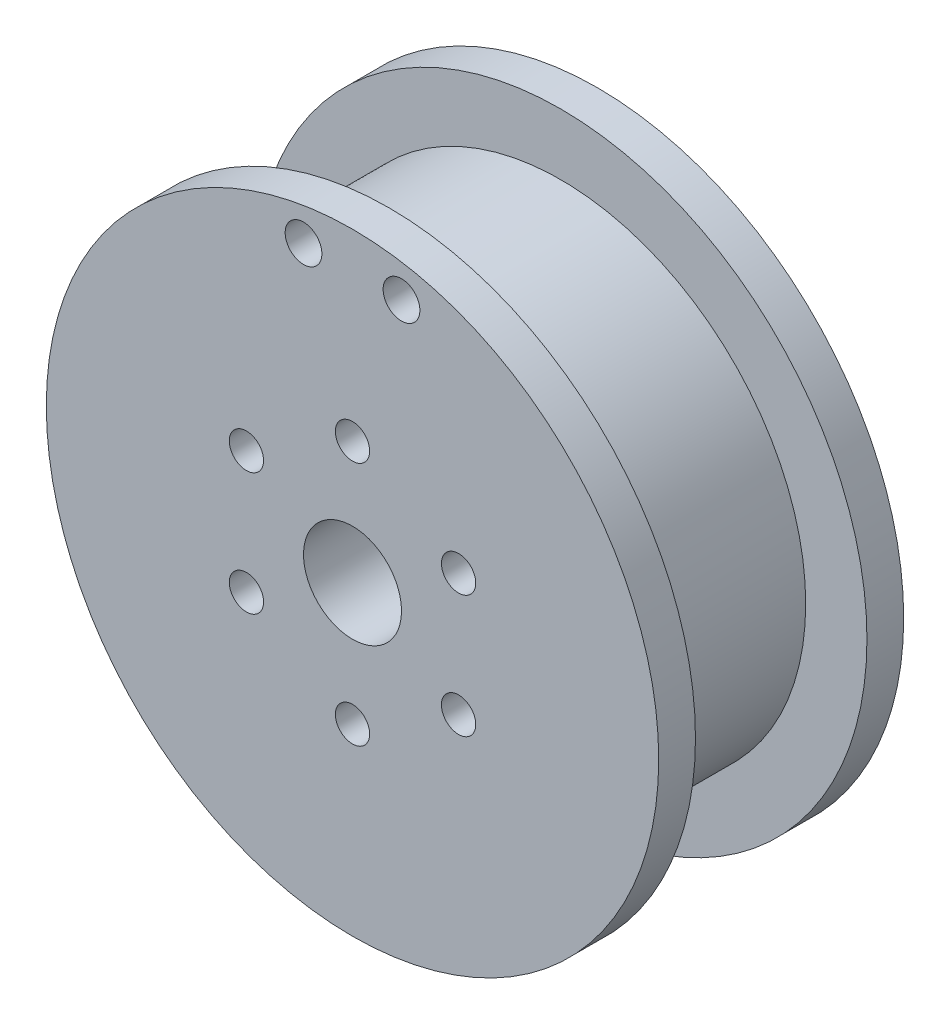
ISO-10303-21;
HEADER;
FILE_DESCRIPTION(('STEP AP214'),'2;1');
FILE_NAME('part.step','',(''),(''),'','','');
FILE_SCHEMA(('AUTOMOTIVE_DESIGN { 1 0 10303 214 1 1 1 1 }'));
ENDSEC;
DATA;
#1=APPLICATION_CONTEXT('core data for automotive mechanical design processes');
#2=APPLICATION_PROTOCOL_DEFINITION('international standard','automotive_design',2000,#1);
#3=PRODUCT_CONTEXT('',#1,'mechanical');
#4=PRODUCT('Part','Part','',(#3));
#5=PRODUCT_RELATED_PRODUCT_CATEGORY('part','',(#4));
#6=PRODUCT_DEFINITION_FORMATION('','',#4);
#7=PRODUCT_DEFINITION_CONTEXT('part definition',#1,'design');
#8=PRODUCT_DEFINITION('design','',#6,#7);
#9=PRODUCT_DEFINITION_SHAPE('','',#8);
#10=(LENGTH_UNIT() NAMED_UNIT(*) SI_UNIT(.MILLI.,.METRE.));
#11=(NAMED_UNIT(*) PLANE_ANGLE_UNIT() SI_UNIT($,.RADIAN.));
#12=(NAMED_UNIT(*) SI_UNIT($,.STERADIAN.) SOLID_ANGLE_UNIT());
#13=UNCERTAINTY_MEASURE_WITH_UNIT(LENGTH_MEASURE(1.E-05),#10,'distance_accuracy_value','');
#14=(GEOMETRIC_REPRESENTATION_CONTEXT(3) GLOBAL_UNCERTAINTY_ASSIGNED_CONTEXT((#13)) GLOBAL_UNIT_ASSIGNED_CONTEXT((#10,
#11,#12)) REPRESENTATION_CONTEXT('',''));
#15=CARTESIAN_POINT('',(0.,0.,0.));
#16=DIRECTION('',(0.,0.,1.));
#17=DIRECTION('',(1.,0.,0.));
#18=AXIS2_PLACEMENT_3D('',#15,#16,#17);
#19=CARTESIAN_POINT('',(0.,0.,10.));
#20=DIRECTION('',(0.,0.,1.));
#21=DIRECTION('',(1.,0.,0.));
#22=AXIS2_PLACEMENT_3D('',#19,#20,#21);
#23=CYLINDRICAL_SURFACE('',#22,20.);
#24=CARTESIAN_POINT('',(0.,0.,7.));
#25=DIRECTION('',(0.,0.,1.));
#26=DIRECTION('',(1.,0.,0.));
#27=AXIS2_PLACEMENT_3D('',#24,#25,#26);
#28=CIRCLE('',#27,20.);
#29=CARTESIAN_POINT('',(20.,0.,7.));
#30=VERTEX_POINT('',#29);
#31=EDGE_CURVE('E65',#30,#30,#28,.T.);
#32=ORIENTED_EDGE('',*,*,#31,.F.);
#33=EDGE_LOOP('',(#32));
#34=FACE_BOUND('',#33,.T.);
#35=CARTESIAN_POINT('',(0.,0.,-7.));
#36=DIRECTION('',(0.,0.,1.));
#37=DIRECTION('',(1.,0.,0.));
#38=AXIS2_PLACEMENT_3D('',#35,#36,#37);
#39=CIRCLE('',#38,20.);
#40=CARTESIAN_POINT('',(20.,0.,-7.));
#41=VERTEX_POINT('',#40);
#42=EDGE_CURVE('E10',#41,#41,#39,.T.);
#43=ORIENTED_EDGE('',*,*,#42,.T.);
#44=EDGE_LOOP('',(#43));
#45=FACE_BOUND('',#44,.T.);
#46=ADVANCED_FACE('F37',(#34,#45),#23,.T.);
#47=CARTESIAN_POINT('',(0.,25.,-7.));
#48=DIRECTION('',(0.,0.,-1.));
#49=DIRECTION('',(-1.,0.,0.));
#50=AXIS2_PLACEMENT_3D('',#47,#48,#49);
#51=PLANE('',#50);
#52=ORIENTED_EDGE('',*,*,#42,.F.);
#53=EDGE_LOOP('',(#52));
#54=FACE_BOUND('',#53,.T.);
#55=CARTESIAN_POINT('',(0.,0.,-7.));
#56=DIRECTION('',(0.,0.,1.));
#57=DIRECTION('',(1.,0.,0.));
#58=AXIS2_PLACEMENT_3D('',#55,#56,#57);
#59=CIRCLE('',#58,25.);
#60=CARTESIAN_POINT('',(25.,0.,-7.));
#61=VERTEX_POINT('',#60);
#62=EDGE_CURVE('E43',#61,#61,#59,.T.);
#63=ORIENTED_EDGE('',*,*,#62,.T.);
#64=EDGE_LOOP('',(#63));
#65=FACE_BOUND('',#64,.T.);
#66=ADVANCED_FACE('F140',(#54,#65),#51,.F.);
#67=CARTESIAN_POINT('',(0.,0.,10.));
#68=DIRECTION('',(0.,0.,1.));
#69=DIRECTION('',(1.,0.,0.));
#70=AXIS2_PLACEMENT_3D('',#67,#68,#69);
#71=CYLINDRICAL_SURFACE('',#70,25.);
#72=ORIENTED_EDGE('',*,*,#62,.F.);
#73=EDGE_LOOP('',(#72));
#74=FACE_BOUND('',#73,.T.);
#75=CARTESIAN_POINT('',(0.,0.,-10.));
#76=DIRECTION('',(0.,0.,1.));
#77=DIRECTION('',(1.,0.,0.));
#78=AXIS2_PLACEMENT_3D('',#75,#76,#77);
#79=CIRCLE('',#78,25.);
#80=CARTESIAN_POINT('',(25.,0.,-10.));
#81=VERTEX_POINT('',#80);
#82=EDGE_CURVE('E47',#81,#81,#79,.T.);
#83=ORIENTED_EDGE('',*,*,#82,.T.);
#84=EDGE_LOOP('',(#83));
#85=FACE_BOUND('',#84,.T.);
#86=ADVANCED_FACE('F144',(#74,#85),#71,.T.);
#87=CARTESIAN_POINT('',(0.,4.,-10.));
#88=DIRECTION('',(0.,0.,1.));
#89=DIRECTION('',(1.,0.,0.));
#90=AXIS2_PLACEMENT_3D('',#87,#88,#89);
#91=PLANE('',#90);
#92=CARTESIAN_POINT('',(0.,10.,-10.));
#93=DIRECTION('',(0.,0.,1.));
#94=DIRECTION('',(1.,0.,0.));
#95=AXIS2_PLACEMENT_3D('',#92,#93,#94);
#96=CIRCLE('',#95,1.4);
#97=CARTESIAN_POINT('',(1.4,10.,-10.));
#98=VERTEX_POINT('',#97);
#99=EDGE_CURVE('E68',#98,#98,#96,.T.);
#100=ORIENTED_EDGE('',*,*,#99,.T.);
#101=EDGE_LOOP('',(#100));
#102=FACE_BOUND('',#101,.T.);
#103=CARTESIAN_POINT('',(-8.66025403784433,5.0000000000001,-10.));
#104=DIRECTION('',(0.,0.,1.));
#105=DIRECTION('',(1.,0.,0.));
#106=AXIS2_PLACEMENT_3D('',#103,#104,#105);
#107=CIRCLE('',#106,1.4);
#108=CARTESIAN_POINT('',(-7.26025403784433,5.0000000000001,-10.));
#109=VERTEX_POINT('',#108);
#110=EDGE_CURVE('E95',#109,#109,#107,.T.);
#111=ORIENTED_EDGE('',*,*,#110,.T.);
#112=EDGE_LOOP('',(#111));
#113=FACE_BOUND('',#112,.T.);
#114=CARTESIAN_POINT('',(-8.66025403784443,-4.99999999999992,-10.));
#115=DIRECTION('',(0.,0.,1.));
#116=DIRECTION('',(1.,0.,0.));
#117=AXIS2_PLACEMENT_3D('',#114,#115,#116);
#118=CIRCLE('',#117,1.4);
#119=CARTESIAN_POINT('',(-7.26025403784443,-4.99999999999992,-10.));
#120=VERTEX_POINT('',#119);
#121=EDGE_CURVE('E69',#120,#120,#118,.T.);
#122=ORIENTED_EDGE('',*,*,#121,.T.);
#123=EDGE_LOOP('',(#122));
#124=FACE_BOUND('',#123,.T.);
#125=CARTESIAN_POINT('',(0.,-10.,-10.));
#126=DIRECTION('',(0.,0.,1.));
#127=DIRECTION('',(1.,0.,0.));
#128=AXIS2_PLACEMENT_3D('',#125,#126,#127);
#129=CIRCLE('',#128,1.4);
#130=CARTESIAN_POINT('',(1.39999999999993,-10.,-10.));
#131=VERTEX_POINT('',#130);
#132=EDGE_CURVE('E76',#131,#131,#129,.T.);
#133=ORIENTED_EDGE('',*,*,#132,.T.);
#134=EDGE_LOOP('',(#133));
#135=FACE_BOUND('',#134,.T.);
#136=CARTESIAN_POINT('',(8.66025403784437,-5.00000000000004,-10.));
#137=DIRECTION('',(0.,0.,1.));
#138=DIRECTION('',(1.,0.,0.));
#139=AXIS2_PLACEMENT_3D('',#136,#137,#138);
#140=CIRCLE('',#139,1.4);
#141=CARTESIAN_POINT('',(10.0602540378444,-5.00000000000004,-10.));
#142=VERTEX_POINT('',#141);
#143=EDGE_CURVE('E82',#142,#142,#140,.T.);
#144=ORIENTED_EDGE('',*,*,#143,.T.);
#145=EDGE_LOOP('',(#144));
#146=FACE_BOUND('',#145,.T.);
#147=CARTESIAN_POINT('',(8.6602540378444,4.99999999999998,-10.));
#148=DIRECTION('',(0.,0.,1.));
#149=DIRECTION('',(1.,0.,0.));
#150=AXIS2_PLACEMENT_3D('',#147,#148,#149);
#151=CIRCLE('',#150,1.4);
#152=CARTESIAN_POINT('',(10.0602540378444,4.99999999999998,-10.));
#153=VERTEX_POINT('',#152);
#154=EDGE_CURVE('E88',#153,#153,#151,.T.);
#155=ORIENTED_EDGE('',*,*,#154,.T.);
#156=EDGE_LOOP('',(#155));
#157=FACE_BOUND('',#156,.T.);
#158=ORIENTED_EDGE('',*,*,#82,.F.);
#159=EDGE_LOOP('',(#158));
#160=FACE_BOUND('',#159,.T.);
#161=CARTESIAN_POINT('',(0.,0.,-10.));
#162=DIRECTION('',(0.,0.,1.));
#163=DIRECTION('',(1.,0.,0.));
#164=AXIS2_PLACEMENT_3D('',#161,#162,#163);
#165=CIRCLE('',#164,4.);
#166=CARTESIAN_POINT('',(4.,0.,-10.));
#167=VERTEX_POINT('',#166);
#168=EDGE_CURVE('E51',#167,#167,#165,.T.);
#169=ORIENTED_EDGE('',*,*,#168,.T.);
#170=EDGE_LOOP('',(#169));
#171=FACE_BOUND('',#170,.T.);
#172=ADVANCED_FACE('F149',(#102,#113,#124,#135,#146,#157,#160,#171),#91,.F.);
#173=CARTESIAN_POINT('',(0.,0.,10.));
#174=DIRECTION('',(0.,0.,1.));
#175=DIRECTION('',(1.,0.,0.));
#176=AXIS2_PLACEMENT_3D('',#173,#174,#175);
#177=CYLINDRICAL_SURFACE('',#176,4.);
#178=ORIENTED_EDGE('',*,*,#168,.F.);
#179=EDGE_LOOP('',(#178));
#180=FACE_BOUND('',#179,.T.);
#181=CARTESIAN_POINT('',(0.,0.,10.));
#182=DIRECTION('',(0.,0.,1.));
#183=DIRECTION('',(1.,0.,0.));
#184=AXIS2_PLACEMENT_3D('',#181,#182,#183);
#185=CIRCLE('',#184,4.);
#186=CARTESIAN_POINT('',(4.,0.,10.));
#187=VERTEX_POINT('',#186);
#188=EDGE_CURVE('E56',#187,#187,#185,.T.);
#189=ORIENTED_EDGE('',*,*,#188,.T.);
#190=EDGE_LOOP('',(#189));
#191=FACE_BOUND('',#190,.T.);
#192=ADVANCED_FACE('F155',(#180,#191),#177,.F.);
#193=CARTESIAN_POINT('',(0.,25.,10.));
#194=DIRECTION('',(0.,0.,-1.));
#195=DIRECTION('',(-1.,0.,0.));
#196=AXIS2_PLACEMENT_3D('',#193,#194,#195);
#197=PLANE('',#196);
#198=CARTESIAN_POINT('',(4.,22.,10.));
#199=DIRECTION('',(0.,0.,-1.));
#200=DIRECTION('',(-1.,0.,0.));
#201=AXIS2_PLACEMENT_3D('',#198,#199,#200);
#202=CIRCLE('',#201,1.5);
#203=CARTESIAN_POINT('',(2.5,22.,10.));
#204=VERTEX_POINT('',#203);
#205=EDGE_CURVE('E98',#204,#204,#202,.T.);
#206=ORIENTED_EDGE('',*,*,#205,.T.);
#207=EDGE_LOOP('',(#206));
#208=FACE_BOUND('',#207,.T.);
#209=CARTESIAN_POINT('',(-4.,22.,10.));
#210=DIRECTION('',(0.,0.,-1.));
#211=DIRECTION('',(-1.,0.,0.));
#212=AXIS2_PLACEMENT_3D('',#209,#210,#211);
#213=CIRCLE('',#212,1.5);
#214=CARTESIAN_POINT('',(-5.5,22.,10.));
#215=VERTEX_POINT('',#214);
#216=EDGE_CURVE('E105',#215,#215,#213,.T.);
#217=ORIENTED_EDGE('',*,*,#216,.T.);
#218=EDGE_LOOP('',(#217));
#219=FACE_BOUND('',#218,.T.);
#220=CARTESIAN_POINT('',(0.,10.,10.));
#221=DIRECTION('',(0.,0.,1.));
#222=DIRECTION('',(1.,0.,0.));
#223=AXIS2_PLACEMENT_3D('',#220,#221,#222);
#224=CIRCLE('',#223,1.4);
#225=CARTESIAN_POINT('',(1.4,10.,10.));
#226=VERTEX_POINT('',#225);
#227=EDGE_CURVE('E94',#226,#226,#224,.T.);
#228=ORIENTED_EDGE('',*,*,#227,.F.);
#229=EDGE_LOOP('',(#228));
#230=FACE_BOUND('',#229,.T.);
#231=CARTESIAN_POINT('',(-8.66025403784433,5.0000000000001,10.));
#232=DIRECTION('',(0.,0.,1.));
#233=DIRECTION('',(1.,0.,0.));
#234=AXIS2_PLACEMENT_3D('',#231,#232,#233);
#235=CIRCLE('',#234,1.4);
#236=CARTESIAN_POINT('',(-7.26025403784433,5.0000000000001,10.));
#237=VERTEX_POINT('',#236);
#238=EDGE_CURVE('E73',#237,#237,#235,.T.);
#239=ORIENTED_EDGE('',*,*,#238,.F.);
#240=EDGE_LOOP('',(#239));
#241=FACE_BOUND('',#240,.T.);
#242=CARTESIAN_POINT('',(-8.66025403784443,-4.99999999999992,10.));
#243=DIRECTION('',(0.,0.,1.));
#244=DIRECTION('',(1.,0.,0.));
#245=AXIS2_PLACEMENT_3D('',#242,#243,#244);
#246=CIRCLE('',#245,1.4);
#247=CARTESIAN_POINT('',(-7.26025403784443,-4.99999999999992,10.));
#248=VERTEX_POINT('',#247);
#249=EDGE_CURVE('E72',#248,#248,#246,.T.);
#250=ORIENTED_EDGE('',*,*,#249,.F.);
#251=EDGE_LOOP('',(#250));
#252=FACE_BOUND('',#251,.T.);
#253=CARTESIAN_POINT('',(0.,-10.,10.));
#254=DIRECTION('',(0.,0.,1.));
#255=DIRECTION('',(1.,0.,0.));
#256=AXIS2_PLACEMENT_3D('',#253,#254,#255);
#257=CIRCLE('',#256,1.4);
#258=CARTESIAN_POINT('',(1.39999999999993,-10.,10.));
#259=VERTEX_POINT('',#258);
#260=EDGE_CURVE('E79',#259,#259,#257,.T.);
#261=ORIENTED_EDGE('',*,*,#260,.F.);
#262=EDGE_LOOP('',(#261));
#263=FACE_BOUND('',#262,.T.);
#264=CARTESIAN_POINT('',(8.66025403784437,-5.00000000000004,10.));
#265=DIRECTION('',(0.,0.,1.));
#266=DIRECTION('',(1.,0.,0.));
#267=AXIS2_PLACEMENT_3D('',#264,#265,#266);
#268=CIRCLE('',#267,1.4);
#269=CARTESIAN_POINT('',(10.0602540378444,-5.00000000000004,10.));
#270=VERTEX_POINT('',#269);
#271=EDGE_CURVE('E85',#270,#270,#268,.T.);
#272=ORIENTED_EDGE('',*,*,#271,.F.);
#273=EDGE_LOOP('',(#272));
#274=FACE_BOUND('',#273,.T.);
#275=CARTESIAN_POINT('',(8.6602540378444,4.99999999999998,10.));
#276=DIRECTION('',(0.,0.,1.));
#277=DIRECTION('',(1.,0.,0.));
#278=AXIS2_PLACEMENT_3D('',#275,#276,#277);
#279=CIRCLE('',#278,1.4);
#280=CARTESIAN_POINT('',(10.0602540378444,4.99999999999998,10.));
#281=VERTEX_POINT('',#280);
#282=EDGE_CURVE('E91',#281,#281,#279,.T.);
#283=ORIENTED_EDGE('',*,*,#282,.F.);
#284=EDGE_LOOP('',(#283));
#285=FACE_BOUND('',#284,.T.);
#286=ORIENTED_EDGE('',*,*,#188,.F.);
#287=EDGE_LOOP('',(#286));
#288=FACE_BOUND('',#287,.T.);
#289=CARTESIAN_POINT('',(0.,0.,10.));
#290=DIRECTION('',(0.,0.,1.));
#291=DIRECTION('',(1.,0.,0.));
#292=AXIS2_PLACEMENT_3D('',#289,#290,#291);
#293=CIRCLE('',#292,25.);
#294=CARTESIAN_POINT('',(25.,0.,10.));
#295=VERTEX_POINT('',#294);
#296=EDGE_CURVE('E59',#295,#295,#293,.T.);
#297=ORIENTED_EDGE('',*,*,#296,.T.);
#298=EDGE_LOOP('',(#297));
#299=FACE_BOUND('',#298,.T.);
#300=ADVANCED_FACE('F117',(#208,#219,#230,#241,#252,#263,#274,#285,#288,#299),#197,.F.);
#301=CARTESIAN_POINT('',(0.,0.,10.));
#302=DIRECTION('',(0.,0.,1.));
#303=DIRECTION('',(1.,0.,0.));
#304=AXIS2_PLACEMENT_3D('',#301,#302,#303);
#305=CYLINDRICAL_SURFACE('',#304,25.);
#306=ORIENTED_EDGE('',*,*,#296,.F.);
#307=EDGE_LOOP('',(#306));
#308=FACE_BOUND('',#307,.T.);
#309=CARTESIAN_POINT('',(0.,0.,7.));
#310=DIRECTION('',(0.,0.,1.));
#311=DIRECTION('',(1.,0.,0.));
#312=AXIS2_PLACEMENT_3D('',#309,#310,#311);
#313=CIRCLE('',#312,25.);
#314=CARTESIAN_POINT('',(25.,0.,7.));
#315=VERTEX_POINT('',#314);
#316=EDGE_CURVE('E62',#315,#315,#313,.T.);
#317=ORIENTED_EDGE('',*,*,#316,.T.);
#318=EDGE_LOOP('',(#317));
#319=FACE_BOUND('',#318,.T.);
#320=ADVANCED_FACE('F131',(#308,#319),#305,.T.);
#321=CARTESIAN_POINT('',(0.,20.,7.));
#322=DIRECTION('',(0.,0.,1.));
#323=DIRECTION('',(1.,0.,0.));
#324=AXIS2_PLACEMENT_3D('',#321,#322,#323);
#325=PLANE('',#324);
#326=CARTESIAN_POINT('',(4.,22.,7.));
#327=DIRECTION('',(0.,0.,-1.));
#328=DIRECTION('',(-1.,0.,0.));
#329=AXIS2_PLACEMENT_3D('',#326,#327,#328);
#330=CIRCLE('',#329,1.5);
#331=CARTESIAN_POINT('',(2.5,22.,7.));
#332=VERTEX_POINT('',#331);
#333=EDGE_CURVE('E111',#332,#332,#330,.T.);
#334=ORIENTED_EDGE('',*,*,#333,.F.);
#335=EDGE_LOOP('',(#334));
#336=FACE_BOUND('',#335,.T.);
#337=CARTESIAN_POINT('',(-4.,22.,7.));
#338=DIRECTION('',(0.,0.,-1.));
#339=DIRECTION('',(-1.,0.,0.));
#340=AXIS2_PLACEMENT_3D('',#337,#338,#339);
#341=CIRCLE('',#340,1.5);
#342=CARTESIAN_POINT('',(-5.5,22.,7.));
#343=VERTEX_POINT('',#342);
#344=EDGE_CURVE('E108',#343,#343,#341,.T.);
#345=ORIENTED_EDGE('',*,*,#344,.F.);
#346=EDGE_LOOP('',(#345));
#347=FACE_BOUND('',#346,.T.);
#348=ORIENTED_EDGE('',*,*,#316,.F.);
#349=EDGE_LOOP('',(#348));
#350=FACE_BOUND('',#349,.T.);
#351=ORIENTED_EDGE('',*,*,#31,.T.);
#352=EDGE_LOOP('',(#351));
#353=FACE_BOUND('',#352,.T.);
#354=ADVANCED_FACE('F127',(#336,#347,#350,#353),#325,.F.);
#355=CARTESIAN_POINT('',(8.6602540378444,4.99999999999998,-10.));
#356=DIRECTION('',(0.,0.,1.));
#357=DIRECTION('',(1.,0.,0.));
#358=AXIS2_PLACEMENT_3D('',#355,#356,#357);
#359=CYLINDRICAL_SURFACE('',#358,1.4);
#360=ORIENTED_EDGE('',*,*,#154,.F.);
#361=EDGE_LOOP('',(#360));
#362=FACE_BOUND('',#361,.T.);
#363=ORIENTED_EDGE('',*,*,#282,.T.);
#364=EDGE_LOOP('',(#363));
#365=FACE_BOUND('',#364,.T.);
#366=ADVANCED_FACE('F130',(#362,#365),#359,.F.);
#367=CARTESIAN_POINT('',(8.66025403784437,-5.00000000000004,-10.));
#368=DIRECTION('',(0.,0.,1.));
#369=DIRECTION('',(1.,0.,0.));
#370=AXIS2_PLACEMENT_3D('',#367,#368,#369);
#371=CYLINDRICAL_SURFACE('',#370,1.4);
#372=ORIENTED_EDGE('',*,*,#143,.F.);
#373=EDGE_LOOP('',(#372));
#374=FACE_BOUND('',#373,.T.);
#375=ORIENTED_EDGE('',*,*,#271,.T.);
#376=EDGE_LOOP('',(#375));
#377=FACE_BOUND('',#376,.T.);
#378=ADVANCED_FACE('F173',(#374,#377),#371,.F.);
#379=CARTESIAN_POINT('',(0.,-10.,-10.));
#380=DIRECTION('',(0.,0.,1.));
#381=DIRECTION('',(1.,0.,0.));
#382=AXIS2_PLACEMENT_3D('',#379,#380,#381);
#383=CYLINDRICAL_SURFACE('',#382,1.4);
#384=ORIENTED_EDGE('',*,*,#132,.F.);
#385=EDGE_LOOP('',(#384));
#386=FACE_BOUND('',#385,.T.);
#387=ORIENTED_EDGE('',*,*,#260,.T.);
#388=EDGE_LOOP('',(#387));
#389=FACE_BOUND('',#388,.T.);
#390=ADVANCED_FACE('F169',(#386,#389),#383,.F.);
#391=CARTESIAN_POINT('',(-8.66025403784443,-4.99999999999992,-10.));
#392=DIRECTION('',(0.,0.,1.));
#393=DIRECTION('',(1.,0.,0.));
#394=AXIS2_PLACEMENT_3D('',#391,#392,#393);
#395=CYLINDRICAL_SURFACE('',#394,1.4);
#396=ORIENTED_EDGE('',*,*,#121,.F.);
#397=EDGE_LOOP('',(#396));
#398=FACE_BOUND('',#397,.T.);
#399=ORIENTED_EDGE('',*,*,#249,.T.);
#400=EDGE_LOOP('',(#399));
#401=FACE_BOUND('',#400,.T.);
#402=ADVANCED_FACE('F165',(#398,#401),#395,.F.);
#403=CARTESIAN_POINT('',(-8.66025403784433,5.0000000000001,-10.));
#404=DIRECTION('',(0.,0.,1.));
#405=DIRECTION('',(1.,0.,0.));
#406=AXIS2_PLACEMENT_3D('',#403,#404,#405);
#407=CYLINDRICAL_SURFACE('',#406,1.4);
#408=ORIENTED_EDGE('',*,*,#110,.F.);
#409=EDGE_LOOP('',(#408));
#410=FACE_BOUND('',#409,.T.);
#411=ORIENTED_EDGE('',*,*,#238,.T.);
#412=EDGE_LOOP('',(#411));
#413=FACE_BOUND('',#412,.T.);
#414=ADVANCED_FACE('F168',(#410,#413),#407,.F.);
#415=CARTESIAN_POINT('',(0.,10.,-10.));
#416=DIRECTION('',(0.,0.,1.));
#417=DIRECTION('',(1.,0.,0.));
#418=AXIS2_PLACEMENT_3D('',#415,#416,#417);
#419=CYLINDRICAL_SURFACE('',#418,1.4);
#420=ORIENTED_EDGE('',*,*,#99,.F.);
#421=EDGE_LOOP('',(#420));
#422=FACE_BOUND('',#421,.T.);
#423=ORIENTED_EDGE('',*,*,#227,.T.);
#424=EDGE_LOOP('',(#423));
#425=FACE_BOUND('',#424,.T.);
#426=ADVANCED_FACE('F183',(#422,#425),#419,.F.);
#427=CARTESIAN_POINT('',(-4.,22.,10.));
#428=DIRECTION('',(0.,0.,-1.));
#429=DIRECTION('',(-1.,0.,0.));
#430=AXIS2_PLACEMENT_3D('',#427,#428,#429);
#431=CYLINDRICAL_SURFACE('',#430,1.5);
#432=ORIENTED_EDGE('',*,*,#216,.F.);
#433=EDGE_LOOP('',(#432));
#434=FACE_BOUND('',#433,.T.);
#435=ORIENTED_EDGE('',*,*,#344,.T.);
#436=EDGE_LOOP('',(#435));
#437=FACE_BOUND('',#436,.T.);
#438=ADVANCED_FACE('F123',(#434,#437),#431,.F.);
#439=CARTESIAN_POINT('',(4.,22.,10.));
#440=DIRECTION('',(0.,0.,-1.));
#441=DIRECTION('',(-1.,0.,0.));
#442=AXIS2_PLACEMENT_3D('',#439,#440,#441);
#443=CYLINDRICAL_SURFACE('',#442,1.5);
#444=ORIENTED_EDGE('',*,*,#205,.F.);
#445=EDGE_LOOP('',(#444));
#446=FACE_BOUND('',#445,.T.);
#447=ORIENTED_EDGE('',*,*,#333,.T.);
#448=EDGE_LOOP('',(#447));
#449=FACE_BOUND('',#448,.T.);
#450=ADVANCED_FACE('F120',(#446,#449),#443,.F.);
#451=CLOSED_SHELL('',(#46,#66,#86,#172,#192,#300,#320,#354,#366,#378,#390,#402,#414,#426,#438,#450));
#452=MANIFOLD_SOLID_BREP('B2',#451);
#453=ADVANCED_BREP_SHAPE_REPRESENTATION('',(#18,#452),#14);
#454=SHAPE_DEFINITION_REPRESENTATION(#9,#453);
ENDSEC;
END-ISO-10303-21;
